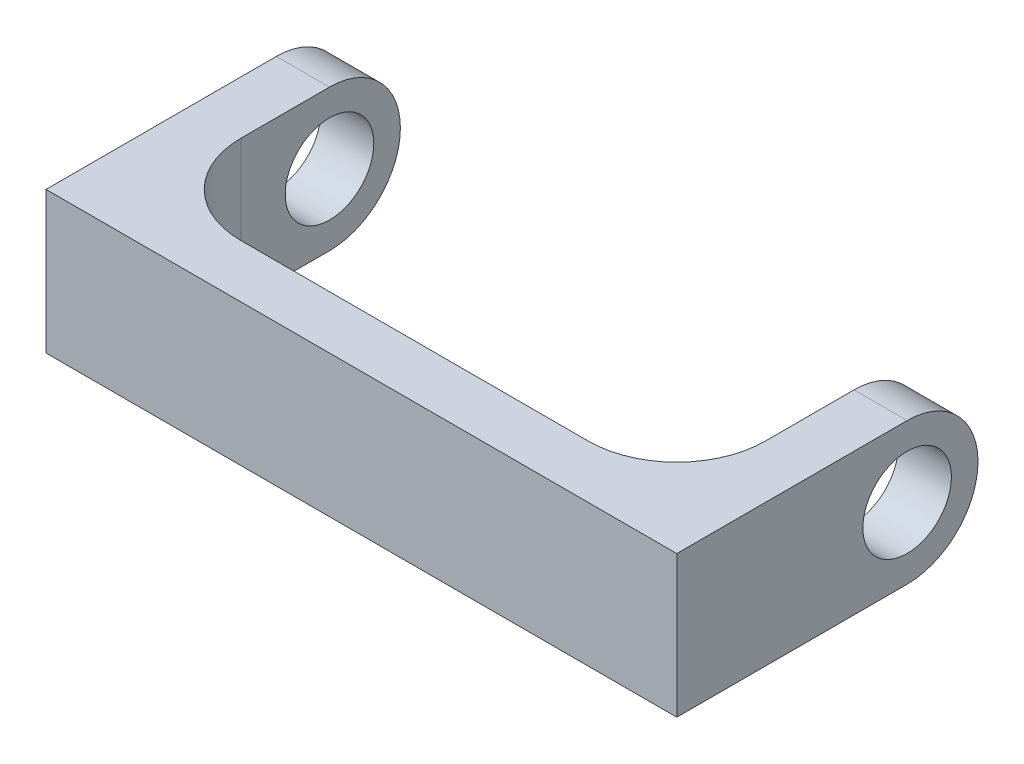
ISO-10303-21;
HEADER;
FILE_DESCRIPTION(('STEP AP214'),'2;1');
FILE_NAME('part.step','',(''),(''),'','','');
FILE_SCHEMA(('AUTOMOTIVE_DESIGN { 1 0 10303 214 1 1 1 1 }'));
ENDSEC;
DATA;
#1=APPLICATION_CONTEXT('core data for automotive mechanical design processes');
#2=APPLICATION_PROTOCOL_DEFINITION('international standard','automotive_design',2000,#1);
#3=PRODUCT_CONTEXT('',#1,'mechanical');
#4=PRODUCT('Part','Part','',(#3));
#5=PRODUCT_RELATED_PRODUCT_CATEGORY('part','',(#4));
#6=PRODUCT_DEFINITION_FORMATION('','',#4);
#7=PRODUCT_DEFINITION_CONTEXT('part definition',#1,'design');
#8=PRODUCT_DEFINITION('design','',#6,#7);
#9=PRODUCT_DEFINITION_SHAPE('','',#8);
#10=(LENGTH_UNIT() NAMED_UNIT(*) SI_UNIT(.MILLI.,.METRE.));
#11=(NAMED_UNIT(*) PLANE_ANGLE_UNIT() SI_UNIT($,.RADIAN.));
#12=(NAMED_UNIT(*) SI_UNIT($,.STERADIAN.) SOLID_ANGLE_UNIT());
#13=UNCERTAINTY_MEASURE_WITH_UNIT(LENGTH_MEASURE(1.E-05),#10,'distance_accuracy_value','');
#14=(GEOMETRIC_REPRESENTATION_CONTEXT(3) GLOBAL_UNCERTAINTY_ASSIGNED_CONTEXT((#13)) GLOBAL_UNIT_ASSIGNED_CONTEXT((#10,
#11,#12)) REPRESENTATION_CONTEXT('',''));
#15=CARTESIAN_POINT('',(0.,0.,0.));
#16=DIRECTION('',(0.,0.,1.));
#17=DIRECTION('',(1.,0.,0.));
#18=AXIS2_PLACEMENT_3D('',#15,#16,#17);
#19=CARTESIAN_POINT('',(2.500000000001,0.,0.));
#20=DIRECTION('',(1.,0.,0.));
#21=DIRECTION('',(0.,0.,-1.));
#22=AXIS2_PLACEMENT_3D('',#19,#20,#21);
#23=PLANE('',#22);
#24=CARTESIAN_POINT('',(2.500000000001,0.,0.));
#25=DIRECTION('',(1.,0.,0.));
#26=DIRECTION('',(0.,0.,-1.));
#27=AXIS2_PLACEMENT_3D('',#24,#25,#26);
#28=CIRCLE('',#27,2.5);
#29=CARTESIAN_POINT('',(2.500000000001,0.,-2.5));
#30=VERTEX_POINT('',#29);
#31=EDGE_CURVE('E176',#30,#30,#28,.T.);
#32=ORIENTED_EDGE('',*,*,#31,.F.);
#33=EDGE_LOOP('',(#32));
#34=FACE_BOUND('',#33,.T.);
#35=DIRECTION('',(0.,0.,1.));
#36=VECTOR('',#35,1.);
#37=CARTESIAN_POINT('',(2.500000000001,4.,0.));
#38=LINE('',#37,#36);
#39=CARTESIAN_POINT('',(2.500000000001,4.,0.));
#40=VERTEX_POINT('',#39);
#41=CARTESIAN_POINT('',(2.500000000001,4.,5.));
#42=VERTEX_POINT('',#41);
#43=EDGE_CURVE('E174',#40,#42,#38,.T.);
#44=ORIENTED_EDGE('',*,*,#43,.T.);
#45=DIRECTION('',(0.,-1.,0.));
#46=VECTOR('',#45,1.);
#47=CARTESIAN_POINT('',(2.500000000001,-4.,5.));
#48=LINE('',#47,#46);
#49=CARTESIAN_POINT('',(2.500000000001,-4.,5.));
#50=VERTEX_POINT('',#49);
#51=EDGE_CURVE('E201',#42,#50,#48,.T.);
#52=ORIENTED_EDGE('',*,*,#51,.T.);
#53=DIRECTION('',(0.,0.,-1.));
#54=VECTOR('',#53,1.);
#55=CARTESIAN_POINT('',(2.500000000001,-4.,0.));
#56=LINE('',#55,#54);
#57=CARTESIAN_POINT('',(2.500000000001,-4.,0.));
#58=VERTEX_POINT('',#57);
#59=EDGE_CURVE('E169',#50,#58,#56,.T.);
#60=ORIENTED_EDGE('',*,*,#59,.T.);
#61=CARTESIAN_POINT('',(2.500000000001,0.,0.));
#62=DIRECTION('',(1.,0.,0.));
#63=DIRECTION('',(0.,0.,-1.));
#64=AXIS2_PLACEMENT_3D('',#61,#62,#63);
#65=CIRCLE('',#64,4.);
#66=EDGE_CURVE('E171',#58,#40,#65,.T.);
#67=ORIENTED_EDGE('',*,*,#66,.T.);
#68=EDGE_LOOP('',(#44,#52,#60,#67));
#69=FACE_BOUND('',#68,.T.);
#70=ADVANCED_FACE('F39',(#34,#69),#23,.T.);
#71=CARTESIAN_POINT('',(2.500000000001,0.,13.));
#72=DIRECTION('',(0.,0.,-1.));
#73=DIRECTION('',(-1.,0.,0.));
#74=AXIS2_PLACEMENT_3D('',#71,#72,#73);
#75=PLANE('',#74);
#76=DIRECTION('',(0.,-1.,0.));
#77=VECTOR('',#76,1.);
#78=CARTESIAN_POINT('',(-0.499999999999001,0.,13.));
#79=LINE('',#78,#77);
#80=CARTESIAN_POINT('',(-0.499999999999001,4.,13.));
#81=VERTEX_POINT('',#80);
#82=CARTESIAN_POINT('',(-0.499999999999001,-4.,13.));
#83=VERTEX_POINT('',#82);
#84=EDGE_CURVE('E124',#81,#83,#79,.T.);
#85=ORIENTED_EDGE('',*,*,#84,.T.);
#86=DIRECTION('',(-1.,0.,0.));
#87=VECTOR('',#86,1.);
#88=CARTESIAN_POINT('',(2.500000000001,-4.,13.));
#89=LINE('',#88,#87);
#90=CARTESIAN_POINT('',(35.099999999999,-4.,13.));
#91=VERTEX_POINT('',#90);
#92=EDGE_CURVE('E117',#91,#83,#89,.T.);
#93=ORIENTED_EDGE('',*,*,#92,.F.);
#94=DIRECTION('',(0.,-1.,0.));
#95=VECTOR('',#94,1.);
#96=CARTESIAN_POINT('',(35.099999999999,0.,13.));
#97=LINE('',#96,#95);
#98=CARTESIAN_POINT('',(35.099999999999,4.,13.));
#99=VERTEX_POINT('',#98);
#100=EDGE_CURVE('E122',#99,#91,#97,.T.);
#101=ORIENTED_EDGE('',*,*,#100,.F.);
#102=DIRECTION('',(-1.,0.,0.));
#103=VECTOR('',#102,1.);
#104=CARTESIAN_POINT('',(2.500000000001,4.,13.));
#105=LINE('',#104,#103);
#106=EDGE_CURVE('E179',#99,#81,#105,.T.);
#107=ORIENTED_EDGE('',*,*,#106,.T.);
#108=EDGE_LOOP('',(#85,#93,#101,#107));
#109=FACE_BOUND('',#108,.T.);
#110=ADVANCED_FACE('F119',(#109),#75,.F.);
#111=CARTESIAN_POINT('',(2.500000000001,-4.,0.));
#112=DIRECTION('',(0.,1.,0.));
#113=DIRECTION('',(0.,0.,1.));
#114=AXIS2_PLACEMENT_3D('',#111,#112,#113);
#115=PLANE('',#114);
#116=DIRECTION('',(0.,0.,-1.));
#117=VECTOR('',#116,1.);
#118=CARTESIAN_POINT('',(-0.499999999999001,-4.,0.));
#119=LINE('',#118,#117);
#120=CARTESIAN_POINT('',(-0.499999999999001,-4.,0.));
#121=VERTEX_POINT('',#120);
#122=EDGE_CURVE('E181',#83,#121,#119,.T.);
#123=ORIENTED_EDGE('',*,*,#122,.T.);
#124=DIRECTION('',(-1.,0.,0.));
#125=VECTOR('',#124,1.);
#126=CARTESIAN_POINT('',(2.500000000001,-4.,0.));
#127=LINE('',#126,#125);
#128=EDGE_CURVE('E127',#58,#121,#127,.T.);
#129=ORIENTED_EDGE('',*,*,#128,.F.);
#130=ORIENTED_EDGE('',*,*,#59,.F.);
#131=CARTESIAN_POINT('',(7.500000000001,-4.,5.));
#132=DIRECTION('',(0.,1.,0.));
#133=DIRECTION('',(0.,0.,1.));
#134=AXIS2_PLACEMENT_3D('',#131,#132,#133);
#135=CIRCLE('',#134,5.);
#136=CARTESIAN_POINT('',(7.500000000001,-4.,10.));
#137=VERTEX_POINT('',#136);
#138=EDGE_CURVE('E47',#50,#137,#135,.T.);
#139=ORIENTED_EDGE('',*,*,#138,.T.);
#140=DIRECTION('',(-1.,0.,0.));
#141=VECTOR('',#140,1.);
#142=CARTESIAN_POINT('',(32.099999999999,-4.,10.));
#143=LINE('',#142,#141);
#144=CARTESIAN_POINT('',(27.099999999999,-4.,10.));
#145=VERTEX_POINT('',#144);
#146=EDGE_CURVE('E166',#145,#137,#143,.T.);
#147=ORIENTED_EDGE('',*,*,#146,.F.);
#148=CARTESIAN_POINT('',(27.099999999999,-4.,5.));
#149=DIRECTION('',(0.,1.,0.));
#150=DIRECTION('',(0.,0.,1.));
#151=AXIS2_PLACEMENT_3D('',#148,#149,#150);
#152=CIRCLE('',#151,5.);
#153=CARTESIAN_POINT('',(32.099999999999,-4.,5.));
#154=VERTEX_POINT('',#153);
#155=EDGE_CURVE('E203',#145,#154,#152,.T.);
#156=ORIENTED_EDGE('',*,*,#155,.T.);
#157=DIRECTION('',(0.,0.,-1.));
#158=VECTOR('',#157,1.);
#159=CARTESIAN_POINT('',(32.099999999999,-4.,0.));
#160=LINE('',#159,#158);
#161=CARTESIAN_POINT('',(32.099999999999,-4.,0.));
#162=VERTEX_POINT('',#161);
#163=EDGE_CURVE('E155',#154,#162,#160,.T.);
#164=ORIENTED_EDGE('',*,*,#163,.T.);
#165=DIRECTION('',(-1.,0.,0.));
#166=VECTOR('',#165,1.);
#167=CARTESIAN_POINT('',(35.099999999999,-4.,0.));
#168=LINE('',#167,#166);
#169=CARTESIAN_POINT('',(35.099999999999,-4.,0.));
#170=VERTEX_POINT('',#169);
#171=EDGE_CURVE('E133',#170,#162,#168,.T.);
#172=ORIENTED_EDGE('',*,*,#171,.F.);
#173=DIRECTION('',(0.,0.,-1.));
#174=VECTOR('',#173,1.);
#175=CARTESIAN_POINT('',(35.099999999999,-4.,0.));
#176=LINE('',#175,#174);
#177=EDGE_CURVE('E130',#91,#170,#176,.T.);
#178=ORIENTED_EDGE('',*,*,#177,.F.);
#179=ORIENTED_EDGE('',*,*,#92,.T.);
#180=EDGE_LOOP('',(#123,#129,#130,#139,#147,#156,#164,#172,#178,#179));
#181=FACE_BOUND('',#180,.T.);
#182=ADVANCED_FACE('F131',(#181),#115,.F.);
#183=CARTESIAN_POINT('',(2.500000000001,0.,0.));
#184=DIRECTION('',(-1.,0.,0.));
#185=DIRECTION('',(0.,0.,1.));
#186=AXIS2_PLACEMENT_3D('',#183,#184,#185);
#187=CYLINDRICAL_SURFACE('',#186,4.);
#188=CARTESIAN_POINT('',(-0.499999999999001,0.,0.));
#189=DIRECTION('',(1.,0.,0.));
#190=DIRECTION('',(0.,0.,-1.));
#191=AXIS2_PLACEMENT_3D('',#188,#189,#190);
#192=CIRCLE('',#191,4.);
#193=CARTESIAN_POINT('',(-0.499999999999001,4.,0.));
#194=VERTEX_POINT('',#193);
#195=EDGE_CURVE('E183',#121,#194,#192,.T.);
#196=ORIENTED_EDGE('',*,*,#195,.T.);
#197=DIRECTION('',(-1.,0.,0.));
#198=VECTOR('',#197,1.);
#199=CARTESIAN_POINT('',(2.500000000001,4.,0.));
#200=LINE('',#199,#198);
#201=EDGE_CURVE('E190',#40,#194,#200,.T.);
#202=ORIENTED_EDGE('',*,*,#201,.F.);
#203=ORIENTED_EDGE('',*,*,#66,.F.);
#204=ORIENTED_EDGE('',*,*,#128,.T.);
#205=EDGE_LOOP('',(#196,#202,#203,#204));
#206=FACE_BOUND('',#205,.T.);
#207=ADVANCED_FACE('F223',(#206),#187,.T.);
#208=CARTESIAN_POINT('',(2.500000000001,4.,0.));
#209=DIRECTION('',(0.,-1.,0.));
#210=DIRECTION('',(0.,0.,-1.));
#211=AXIS2_PLACEMENT_3D('',#208,#209,#210);
#212=PLANE('',#211);
#213=DIRECTION('',(0.,0.,1.));
#214=VECTOR('',#213,1.);
#215=CARTESIAN_POINT('',(-0.499999999999001,4.,0.));
#216=LINE('',#215,#214);
#217=EDGE_CURVE('E185',#194,#81,#216,.T.);
#218=ORIENTED_EDGE('',*,*,#217,.T.);
#219=ORIENTED_EDGE('',*,*,#106,.F.);
#220=DIRECTION('',(0.,0.,1.));
#221=VECTOR('',#220,1.);
#222=CARTESIAN_POINT('',(35.099999999999,4.,0.));
#223=LINE('',#222,#221);
#224=CARTESIAN_POINT('',(35.099999999999,4.,0.));
#225=VERTEX_POINT('',#224);
#226=EDGE_CURVE('E142',#225,#99,#223,.T.);
#227=ORIENTED_EDGE('',*,*,#226,.F.);
#228=DIRECTION('',(-1.,0.,0.));
#229=VECTOR('',#228,1.);
#230=CARTESIAN_POINT('',(35.099999999999,4.,0.));
#231=LINE('',#230,#229);
#232=CARTESIAN_POINT('',(32.099999999999,4.,0.));
#233=VERTEX_POINT('',#232);
#234=EDGE_CURVE('E154',#225,#233,#231,.T.);
#235=ORIENTED_EDGE('',*,*,#234,.T.);
#236=DIRECTION('',(0.,0.,1.));
#237=VECTOR('',#236,1.);
#238=CARTESIAN_POINT('',(32.099999999999,4.,0.));
#239=LINE('',#238,#237);
#240=CARTESIAN_POINT('',(32.099999999999,4.,5.));
#241=VERTEX_POINT('',#240);
#242=EDGE_CURVE('E146',#233,#241,#239,.T.);
#243=ORIENTED_EDGE('',*,*,#242,.T.);
#244=CARTESIAN_POINT('',(27.099999999999,4.,5.));
#245=DIRECTION('',(0.,-1.,0.));
#246=DIRECTION('',(0.,0.,-1.));
#247=AXIS2_PLACEMENT_3D('',#244,#245,#246);
#248=CIRCLE('',#247,5.);
#249=CARTESIAN_POINT('',(27.099999999999,4.,10.));
#250=VERTEX_POINT('',#249);
#251=EDGE_CURVE('E205',#241,#250,#248,.T.);
#252=ORIENTED_EDGE('',*,*,#251,.T.);
#253=DIRECTION('',(-1.,0.,0.));
#254=VECTOR('',#253,1.);
#255=CARTESIAN_POINT('',(32.099999999999,4.,10.));
#256=LINE('',#255,#254);
#257=CARTESIAN_POINT('',(7.500000000001,4.,10.));
#258=VERTEX_POINT('',#257);
#259=EDGE_CURVE('E164',#250,#258,#256,.T.);
#260=ORIENTED_EDGE('',*,*,#259,.T.);
#261=CARTESIAN_POINT('',(7.500000000001,4.,5.));
#262=DIRECTION('',(0.,-1.,0.));
#263=DIRECTION('',(0.,0.,-1.));
#264=AXIS2_PLACEMENT_3D('',#261,#262,#263);
#265=CIRCLE('',#264,5.);
#266=EDGE_CURVE('E11',#258,#42,#265,.T.);
#267=ORIENTED_EDGE('',*,*,#266,.T.);
#268=ORIENTED_EDGE('',*,*,#43,.F.);
#269=ORIENTED_EDGE('',*,*,#201,.T.);
#270=EDGE_LOOP('',(#218,#219,#227,#235,#243,#252,#260,#267,#268,#269));
#271=FACE_BOUND('',#270,.T.);
#272=ADVANCED_FACE('F216',(#271),#212,.F.);
#273=CARTESIAN_POINT('',(2.500000000001,0.,0.));
#274=DIRECTION('',(-1.,0.,0.));
#275=DIRECTION('',(0.,0.,1.));
#276=AXIS2_PLACEMENT_3D('',#273,#274,#275);
#277=CYLINDRICAL_SURFACE('',#276,2.5);
#278=ORIENTED_EDGE('',*,*,#31,.T.);
#279=EDGE_LOOP('',(#278));
#280=FACE_BOUND('',#279,.T.);
#281=CARTESIAN_POINT('',(-0.499999999999001,0.,0.));
#282=DIRECTION('',(1.,0.,0.));
#283=DIRECTION('',(0.,0.,-1.));
#284=AXIS2_PLACEMENT_3D('',#281,#282,#283);
#285=CIRCLE('',#284,2.5);
#286=CARTESIAN_POINT('',(-0.499999999999001,0.,-2.5));
#287=VERTEX_POINT('',#286);
#288=EDGE_CURVE('E172',#287,#287,#285,.T.);
#289=ORIENTED_EDGE('',*,*,#288,.F.);
#290=EDGE_LOOP('',(#289));
#291=FACE_BOUND('',#290,.T.);
#292=ADVANCED_FACE('F230',(#280,#291),#277,.F.);
#293=CARTESIAN_POINT('',(-0.499999999999001,0.,0.));
#294=DIRECTION('',(1.,0.,0.));
#295=DIRECTION('',(0.,0.,-1.));
#296=AXIS2_PLACEMENT_3D('',#293,#294,#295);
#297=PLANE('',#296);
#298=ORIENTED_EDGE('',*,*,#84,.F.);
#299=ORIENTED_EDGE('',*,*,#217,.F.);
#300=ORIENTED_EDGE('',*,*,#195,.F.);
#301=ORIENTED_EDGE('',*,*,#122,.F.);
#302=EDGE_LOOP('',(#298,#299,#300,#301));
#303=FACE_BOUND('',#302,.T.);
#304=ORIENTED_EDGE('',*,*,#288,.T.);
#305=EDGE_LOOP('',(#304));
#306=FACE_BOUND('',#305,.T.);
#307=ADVANCED_FACE('F221',(#303,#306),#297,.F.);
#308=CARTESIAN_POINT('',(32.099999999999,0.,10.));
#309=DIRECTION('',(0.,0.,-1.));
#310=DIRECTION('',(-1.,0.,0.));
#311=AXIS2_PLACEMENT_3D('',#308,#309,#310);
#312=PLANE('',#311);
#313=ORIENTED_EDGE('',*,*,#259,.F.);
#314=DIRECTION('',(0.,-1.,0.));
#315=VECTOR('',#314,1.);
#316=CARTESIAN_POINT('',(27.099999999999,0.,10.));
#317=LINE('',#316,#315);
#318=EDGE_CURVE('E196',#250,#145,#317,.T.);
#319=ORIENTED_EDGE('',*,*,#318,.T.);
#320=ORIENTED_EDGE('',*,*,#146,.T.);
#321=DIRECTION('',(0.,-1.,0.));
#322=VECTOR('',#321,1.);
#323=CARTESIAN_POINT('',(7.500000000001,4.,10.));
#324=LINE('',#323,#322);
#325=EDGE_CURVE('E126',#137,#258,#324,.F.);
#326=ORIENTED_EDGE('',*,*,#325,.T.);
#327=EDGE_LOOP('',(#313,#319,#320,#326));
#328=FACE_BOUND('',#327,.T.);
#329=ADVANCED_FACE('F211',(#328),#312,.T.);
#330=CARTESIAN_POINT('',(35.099999999999,0.,0.));
#331=DIRECTION('',(-1.,0.,0.));
#332=DIRECTION('',(0.,0.,1.));
#333=AXIS2_PLACEMENT_3D('',#330,#331,#332);
#334=CYLINDRICAL_SURFACE('',#333,4.);
#335=CARTESIAN_POINT('',(32.099999999999,0.,0.));
#336=DIRECTION('',(1.,0.,0.));
#337=DIRECTION('',(0.,0.,-1.));
#338=AXIS2_PLACEMENT_3D('',#335,#336,#337);
#339=CIRCLE('',#338,4.);
#340=EDGE_CURVE('E157',#162,#233,#339,.T.);
#341=ORIENTED_EDGE('',*,*,#340,.T.);
#342=ORIENTED_EDGE('',*,*,#234,.F.);
#343=CARTESIAN_POINT('',(35.099999999999,0.,0.));
#344=DIRECTION('',(1.,0.,0.));
#345=DIRECTION('',(0.,0.,-1.));
#346=AXIS2_PLACEMENT_3D('',#343,#344,#345);
#347=CIRCLE('',#346,4.);
#348=EDGE_CURVE('E136',#170,#225,#347,.T.);
#349=ORIENTED_EDGE('',*,*,#348,.F.);
#350=ORIENTED_EDGE('',*,*,#171,.T.);
#351=EDGE_LOOP('',(#341,#342,#349,#350));
#352=FACE_BOUND('',#351,.T.);
#353=ADVANCED_FACE('F265',(#352),#334,.T.);
#354=CARTESIAN_POINT('',(35.099999999999,0.,0.));
#355=DIRECTION('',(-1.,0.,0.));
#356=DIRECTION('',(0.,0.,1.));
#357=AXIS2_PLACEMENT_3D('',#354,#355,#356);
#358=CYLINDRICAL_SURFACE('',#357,2.5);
#359=CARTESIAN_POINT('',(35.099999999999,0.,0.));
#360=DIRECTION('',(1.,0.,0.));
#361=DIRECTION('',(0.,0.,-1.));
#362=AXIS2_PLACEMENT_3D('',#359,#360,#361);
#363=CIRCLE('',#362,2.5);
#364=CARTESIAN_POINT('',(35.099999999999,0.,-2.5));
#365=VERTEX_POINT('',#364);
#366=EDGE_CURVE('E151',#365,#365,#363,.T.);
#367=ORIENTED_EDGE('',*,*,#366,.T.);
#368=EDGE_LOOP('',(#367));
#369=FACE_BOUND('',#368,.T.);
#370=CARTESIAN_POINT('',(32.099999999999,0.,0.));
#371=DIRECTION('',(1.,0.,0.));
#372=DIRECTION('',(0.,0.,-1.));
#373=AXIS2_PLACEMENT_3D('',#370,#371,#372);
#374=CIRCLE('',#373,2.5);
#375=CARTESIAN_POINT('',(32.099999999999,0.,-2.5));
#376=VERTEX_POINT('',#375);
#377=EDGE_CURVE('E143',#376,#376,#374,.T.);
#378=ORIENTED_EDGE('',*,*,#377,.F.);
#379=EDGE_LOOP('',(#378));
#380=FACE_BOUND('',#379,.T.);
#381=ADVANCED_FACE('F272',(#369,#380),#358,.F.);
#382=CARTESIAN_POINT('',(35.099999999999,0.,0.));
#383=DIRECTION('',(1.,0.,0.));
#384=DIRECTION('',(0.,0.,-1.));
#385=AXIS2_PLACEMENT_3D('',#382,#383,#384);
#386=PLANE('',#385);
#387=ORIENTED_EDGE('',*,*,#100,.T.);
#388=ORIENTED_EDGE('',*,*,#177,.T.);
#389=ORIENTED_EDGE('',*,*,#348,.T.);
#390=ORIENTED_EDGE('',*,*,#226,.T.);
#391=EDGE_LOOP('',(#387,#388,#389,#390));
#392=FACE_BOUND('',#391,.T.);
#393=ORIENTED_EDGE('',*,*,#366,.F.);
#394=EDGE_LOOP('',(#393));
#395=FACE_BOUND('',#394,.T.);
#396=ADVANCED_FACE('F139',(#392,#395),#386,.T.);
#397=CARTESIAN_POINT('',(32.099999999999,0.,0.));
#398=DIRECTION('',(1.,0.,0.));
#399=DIRECTION('',(0.,0.,-1.));
#400=AXIS2_PLACEMENT_3D('',#397,#398,#399);
#401=PLANE('',#400);
#402=ORIENTED_EDGE('',*,*,#163,.F.);
#403=DIRECTION('',(0.,-1.,0.));
#404=VECTOR('',#403,1.);
#405=CARTESIAN_POINT('',(32.099999999999,0.,5.));
#406=LINE('',#405,#404);
#407=EDGE_CURVE('E199',#154,#241,#406,.F.);
#408=ORIENTED_EDGE('',*,*,#407,.T.);
#409=ORIENTED_EDGE('',*,*,#242,.F.);
#410=ORIENTED_EDGE('',*,*,#340,.F.);
#411=EDGE_LOOP('',(#402,#408,#409,#410));
#412=FACE_BOUND('',#411,.T.);
#413=ORIENTED_EDGE('',*,*,#377,.T.);
#414=EDGE_LOOP('',(#413));
#415=FACE_BOUND('',#414,.T.);
#416=ADVANCED_FACE('F286',(#412,#415),#401,.F.);
#417=CARTESIAN_POINT('',(27.099999999999,0.,5.));
#418=DIRECTION('',(0.,-1.,0.));
#419=DIRECTION('',(0.,0.,-1.));
#420=AXIS2_PLACEMENT_3D('',#417,#418,#419);
#421=CYLINDRICAL_SURFACE('',#420,5.);
#422=ORIENTED_EDGE('',*,*,#251,.F.);
#423=ORIENTED_EDGE('',*,*,#407,.F.);
#424=ORIENTED_EDGE('',*,*,#155,.F.);
#425=ORIENTED_EDGE('',*,*,#318,.F.);
#426=EDGE_LOOP('',(#422,#423,#424,#425));
#427=FACE_BOUND('',#426,.T.);
#428=ADVANCED_FACE('F292',(#427),#421,.F.);
#429=CARTESIAN_POINT('',(7.500000000001,0.,5.));
#430=DIRECTION('',(0.,1.,0.));
#431=DIRECTION('',(0.,0.,1.));
#432=AXIS2_PLACEMENT_3D('',#429,#430,#431);
#433=CYLINDRICAL_SURFACE('',#432,5.);
#434=ORIENTED_EDGE('',*,*,#266,.F.);
#435=ORIENTED_EDGE('',*,*,#325,.F.);
#436=ORIENTED_EDGE('',*,*,#138,.F.);
#437=ORIENTED_EDGE('',*,*,#51,.F.);
#438=EDGE_LOOP('',(#434,#435,#436,#437));
#439=FACE_BOUND('',#438,.T.);
#440=ADVANCED_FACE('F41',(#439),#433,.F.);
#441=CLOSED_SHELL('',(#70,#110,#182,#207,#272,#292,#307,#329,#353,#381,#396,#416,#428,#440));
#442=MANIFOLD_SOLID_BREP('B2',#441);
#443=ADVANCED_BREP_SHAPE_REPRESENTATION('',(#18,#442),#14);
#444=SHAPE_DEFINITION_REPRESENTATION(#9,#443);
ENDSEC;
END-ISO-10303-21;
